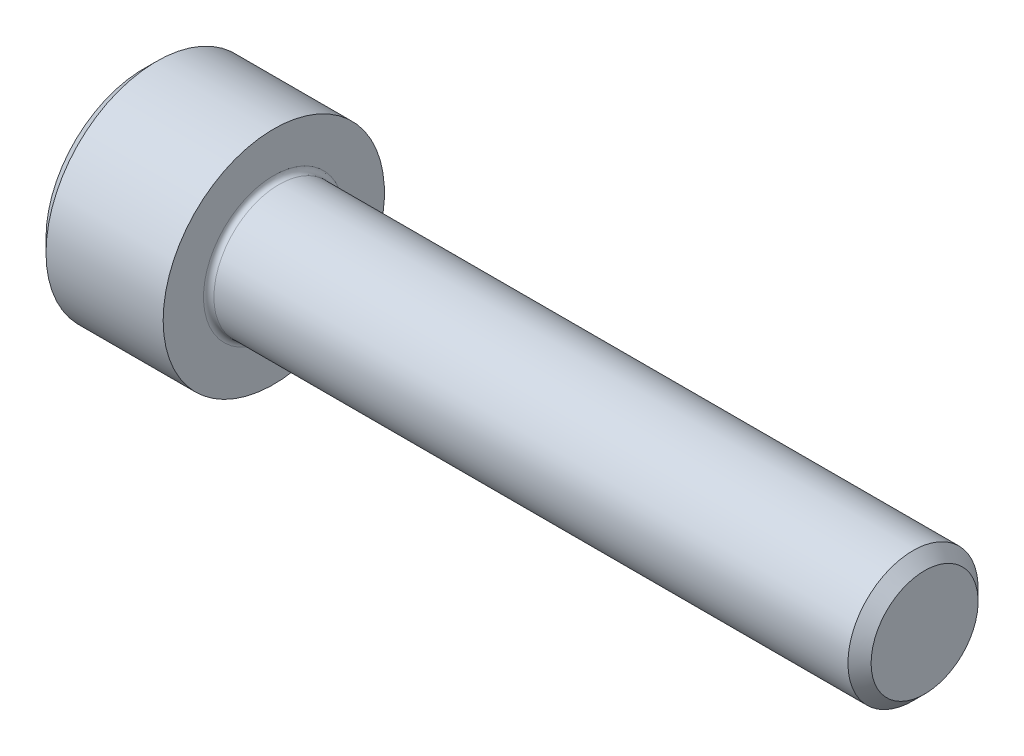
ISO-10303-21;
HEADER;
FILE_DESCRIPTION(('STEP AP214'),'2;1');
FILE_NAME('part.step','',(''),(''),'','','');
FILE_SCHEMA(('AUTOMOTIVE_DESIGN { 1 0 10303 214 1 1 1 1 }'));
ENDSEC;
DATA;
#1=APPLICATION_CONTEXT('core data for automotive mechanical design processes');
#2=APPLICATION_PROTOCOL_DEFINITION('international standard','automotive_design',2000,#1);
#3=PRODUCT_CONTEXT('',#1,'mechanical');
#4=PRODUCT('Part','Part','',(#3));
#5=PRODUCT_RELATED_PRODUCT_CATEGORY('part','',(#4));
#6=PRODUCT_DEFINITION_FORMATION('','',#4);
#7=PRODUCT_DEFINITION_CONTEXT('part definition',#1,'design');
#8=PRODUCT_DEFINITION('design','',#6,#7);
#9=PRODUCT_DEFINITION_SHAPE('','',#8);
#10=(LENGTH_UNIT() NAMED_UNIT(*) SI_UNIT(.MILLI.,.METRE.));
#11=(NAMED_UNIT(*) PLANE_ANGLE_UNIT() SI_UNIT($,.RADIAN.));
#12=(NAMED_UNIT(*) SI_UNIT($,.STERADIAN.) SOLID_ANGLE_UNIT());
#13=UNCERTAINTY_MEASURE_WITH_UNIT(LENGTH_MEASURE(1.E-05),#10,'distance_accuracy_value','');
#14=(GEOMETRIC_REPRESENTATION_CONTEXT(3) GLOBAL_UNCERTAINTY_ASSIGNED_CONTEXT((#13)) GLOBAL_UNIT_ASSIGNED_CONTEXT((#10,
#11,#12)) REPRESENTATION_CONTEXT('',''));
#15=CARTESIAN_POINT('',(0.,0.,0.));
#16=DIRECTION('',(0.,0.,1.));
#17=DIRECTION('',(1.,0.,0.));
#18=AXIS2_PLACEMENT_3D('',#15,#16,#17);
#19=CARTESIAN_POINT('',(0.,0.,0.));
#20=DIRECTION('',(-1.,0.,0.));
#21=DIRECTION('',(0.,0.,1.));
#22=AXIS2_PLACEMENT_3D('',#19,#20,#21);
#23=PLANE('',#22);
#24=DIRECTION('',(0.,-0.499999999999999,0.866025403784439));
#25=VECTOR('',#24,1.);
#26=CARTESIAN_POINT('',(0.,2.35789849937043,0.));
#27=LINE('',#26,#25);
#28=CARTESIAN_POINT('',(0.,2.35789849937043,0.));
#29=VERTEX_POINT('',#28);
#30=CARTESIAN_POINT('',(0.,1.17894924968522,2.042));
#31=VERTEX_POINT('',#30);
#32=EDGE_CURVE('E114',#29,#31,#27,.T.);
#33=ORIENTED_EDGE('',*,*,#32,.T.);
#34=DIRECTION('',(0.,1.,0.));
#35=VECTOR('',#34,1.);
#36=CARTESIAN_POINT('',(0.,-1.17894924968522,2.042));
#37=LINE('',#36,#35);
#38=CARTESIAN_POINT('',(0.,-1.17894924968522,2.042));
#39=VERTEX_POINT('',#38);
#40=EDGE_CURVE('E103',#39,#31,#37,.T.);
#41=ORIENTED_EDGE('',*,*,#40,.F.);
#42=DIRECTION('',(0.,-0.500000000000001,-0.866025403784438));
#43=VECTOR('',#42,1.);
#44=CARTESIAN_POINT('',(0.,-1.17894924968522,2.042));
#45=LINE('',#44,#43);
#46=CARTESIAN_POINT('',(0.,-2.35789849937043,0.));
#47=VERTEX_POINT('',#46);
#48=EDGE_CURVE('E113',#39,#47,#45,.T.);
#49=ORIENTED_EDGE('',*,*,#48,.T.);
#50=DIRECTION('',(0.,0.499999999999998,-0.86602540378444));
#51=VECTOR('',#50,1.);
#52=CARTESIAN_POINT('',(0.,-2.35789849937043,0.));
#53=LINE('',#52,#51);
#54=CARTESIAN_POINT('',(0.,-1.17894924968522,-2.042));
#55=VERTEX_POINT('',#54);
#56=EDGE_CURVE('E132',#47,#55,#53,.T.);
#57=ORIENTED_EDGE('',*,*,#56,.T.);
#58=DIRECTION('',(0.,-1.,0.));
#59=VECTOR('',#58,1.);
#60=CARTESIAN_POINT('',(0.,1.17894924968521,-2.042));
#61=LINE('',#60,#59);
#62=CARTESIAN_POINT('',(0.,1.17894924968521,-2.042));
#63=VERTEX_POINT('',#62);
#64=EDGE_CURVE('E135',#63,#55,#61,.T.);
#65=ORIENTED_EDGE('',*,*,#64,.F.);
#66=DIRECTION('',(0.,-0.500000000000001,-0.866025403784438));
#67=VECTOR('',#66,1.);
#68=CARTESIAN_POINT('',(0.,2.35789849937043,0.));
#69=LINE('',#68,#67);
#70=EDGE_CURVE('E128',#29,#63,#69,.T.);
#71=ORIENTED_EDGE('',*,*,#70,.F.);
#72=EDGE_LOOP('',(#33,#41,#49,#57,#65,#71));
#73=FACE_BOUND('',#72,.T.);
#74=CARTESIAN_POINT('',(0.,0.,0.));
#75=DIRECTION('',(-1.,0.,0.));
#76=DIRECTION('',(0.,0.,1.));
#77=AXIS2_PLACEMENT_3D('',#74,#75,#76);
#78=CIRCLE('',#77,3.75);
#79=CARTESIAN_POINT('',(0.,0.,3.75));
#80=VERTEX_POINT('',#79);
#81=EDGE_CURVE('E186',#80,#80,#78,.T.);
#82=ORIENTED_EDGE('',*,*,#81,.T.);
#83=EDGE_LOOP('',(#82));
#84=FACE_BOUND('',#83,.T.);
#85=ADVANCED_FACE('F32',(#73,#84),#23,.T.);
#86=CARTESIAN_POINT('',(0.,0.,0.));
#87=DIRECTION('',(1.,0.,0.));
#88=DIRECTION('',(0.,0.,-1.));
#89=AXIS2_PLACEMENT_3D('',#86,#87,#88);
#90=CONICAL_SURFACE('',#89,3.75,0.785398163397443);
#91=CARTESIAN_POINT('',(0.5,0.,0.));
#92=DIRECTION('',(-1.,0.,0.));
#93=DIRECTION('',(0.,0.,1.));
#94=AXIS2_PLACEMENT_3D('',#91,#92,#93);
#95=CIRCLE('',#94,4.25);
#96=CARTESIAN_POINT('',(0.5,0.,4.25));
#97=VERTEX_POINT('',#96);
#98=EDGE_CURVE('E183',#97,#97,#95,.T.);
#99=ORIENTED_EDGE('',*,*,#98,.T.);
#100=EDGE_LOOP('',(#99));
#101=FACE_BOUND('',#100,.T.);
#102=ORIENTED_EDGE('',*,*,#81,.F.);
#103=EDGE_LOOP('',(#102));
#104=FACE_BOUND('',#103,.T.);
#105=ADVANCED_FACE('F210',(#101,#104),#90,.T.);
#106=CARTESIAN_POINT('',(-31.75,0.,0.));
#107=DIRECTION('',(-1.,0.,0.));
#108=DIRECTION('',(0.,0.,1.));
#109=AXIS2_PLACEMENT_3D('',#106,#107,#108);
#110=CYLINDRICAL_SURFACE('',#109,4.25);
#111=CARTESIAN_POINT('',(5.,0.,0.));
#112=DIRECTION('',(-1.,0.,0.));
#113=DIRECTION('',(0.,0.,1.));
#114=AXIS2_PLACEMENT_3D('',#111,#112,#113);
#115=CIRCLE('',#114,4.25);
#116=CARTESIAN_POINT('',(5.,0.,4.25));
#117=VERTEX_POINT('',#116);
#118=EDGE_CURVE('E180',#117,#117,#115,.T.);
#119=ORIENTED_EDGE('',*,*,#118,.T.);
#120=EDGE_LOOP('',(#119));
#121=FACE_BOUND('',#120,.T.);
#122=ORIENTED_EDGE('',*,*,#98,.F.);
#123=EDGE_LOOP('',(#122));
#124=FACE_BOUND('',#123,.T.);
#125=ADVANCED_FACE('F214',(#121,#124),#110,.T.);
#126=CARTESIAN_POINT('',(5.,4.25,0.));
#127=DIRECTION('',(1.,0.,0.));
#128=DIRECTION('',(0.,0.,-1.));
#129=AXIS2_PLACEMENT_3D('',#126,#127,#128);
#130=PLANE('',#129);
#131=CARTESIAN_POINT('',(5.,0.,0.));
#132=DIRECTION('',(1.,0.,0.));
#133=DIRECTION('',(0.,0.,-1.));
#134=AXIS2_PLACEMENT_3D('',#131,#132,#133);
#135=CIRCLE('',#134,2.7);
#136=CARTESIAN_POINT('',(5.,0.,-2.7));
#137=VERTEX_POINT('',#136);
#138=EDGE_CURVE('E39',#137,#137,#135,.F.);
#139=ORIENTED_EDGE('',*,*,#138,.T.);
#140=EDGE_LOOP('',(#139));
#141=FACE_BOUND('',#140,.T.);
#142=ORIENTED_EDGE('',*,*,#118,.F.);
#143=EDGE_LOOP('',(#142));
#144=FACE_BOUND('',#143,.T.);
#145=ADVANCED_FACE('F191',(#141,#144),#130,.T.);
#146=CARTESIAN_POINT('',(-31.75,0.,0.));
#147=DIRECTION('',(-1.,0.,0.));
#148=DIRECTION('',(0.,0.,1.));
#149=AXIS2_PLACEMENT_3D('',#146,#147,#148);
#150=CYLINDRICAL_SURFACE('',#149,2.5);
#151=CARTESIAN_POINT('',(5.2,0.,0.));
#152=DIRECTION('',(1.,0.,0.));
#153=DIRECTION('',(0.,0.,-1.));
#154=AXIS2_PLACEMENT_3D('',#151,#152,#153);
#155=CIRCLE('',#154,2.5);
#156=CARTESIAN_POINT('',(5.2,0.,-2.5));
#157=VERTEX_POINT('',#156);
#158=EDGE_CURVE('E11',#157,#157,#155,.T.);
#159=ORIENTED_EDGE('',*,*,#158,.T.);
#160=EDGE_LOOP('',(#159));
#161=FACE_BOUND('',#160,.T.);
#162=CARTESIAN_POINT('',(29.555,0.,0.));
#163=DIRECTION('',(-1.,0.,0.));
#164=DIRECTION('',(0.,0.,1.));
#165=AXIS2_PLACEMENT_3D('',#162,#163,#164);
#166=CIRCLE('',#165,2.5);
#167=CARTESIAN_POINT('',(29.555,0.,2.5));
#168=VERTEX_POINT('',#167);
#169=EDGE_CURVE('E177',#168,#168,#166,.T.);
#170=ORIENTED_EDGE('',*,*,#169,.T.);
#171=EDGE_LOOP('',(#170));
#172=FACE_BOUND('',#171,.T.);
#173=ADVANCED_FACE('F225',(#161,#172),#150,.T.);
#174=CARTESIAN_POINT('',(30.,0.,0.));
#175=DIRECTION('',(-1.,0.,0.));
#176=DIRECTION('',(0.,0.,1.));
#177=AXIS2_PLACEMENT_3D('',#174,#175,#176);
#178=CONICAL_SURFACE('',#177,2.055,0.785398163397462);
#179=ORIENTED_EDGE('',*,*,#169,.F.);
#180=EDGE_LOOP('',(#179));
#181=FACE_BOUND('',#180,.T.);
#182=CARTESIAN_POINT('',(30.,0.,0.));
#183=DIRECTION('',(-1.,0.,0.));
#184=DIRECTION('',(0.,0.,1.));
#185=AXIS2_PLACEMENT_3D('',#182,#183,#184);
#186=CIRCLE('',#185,2.055);
#187=CARTESIAN_POINT('',(30.,0.,2.055));
#188=VERTEX_POINT('',#187);
#189=EDGE_CURVE('E173',#188,#188,#186,.T.);
#190=ORIENTED_EDGE('',*,*,#189,.T.);
#191=EDGE_LOOP('',(#190));
#192=FACE_BOUND('',#191,.T.);
#193=ADVANCED_FACE('F204',(#181,#192),#178,.T.);
#194=CARTESIAN_POINT('',(30.,2.055,0.));
#195=DIRECTION('',(1.,0.,0.));
#196=DIRECTION('',(0.,0.,-1.));
#197=AXIS2_PLACEMENT_3D('',#194,#195,#196);
#198=PLANE('',#197);
#199=ORIENTED_EDGE('',*,*,#189,.F.);
#200=EDGE_LOOP('',(#199));
#201=FACE_BOUND('',#200,.T.);
#202=ADVANCED_FACE('F196',(#201),#198,.T.);
#203=CARTESIAN_POINT('',(5.2,0.,0.));
#204=DIRECTION('',(1.,0.,0.));
#205=DIRECTION('',(0.,0.,-1.));
#206=AXIS2_PLACEMENT_3D('',#203,#204,#205);
#207=TOROIDAL_SURFACE('',#206,2.7,0.2);
#208=ORIENTED_EDGE('',*,*,#158,.F.);
#209=EDGE_LOOP('',(#208));
#210=FACE_BOUND('',#209,.T.);
#211=ORIENTED_EDGE('',*,*,#138,.F.);
#212=EDGE_LOOP('',(#211));
#213=FACE_BOUND('',#212,.T.);
#214=ADVANCED_FACE('F194',(#210,#213),#207,.F.);
#215=CARTESIAN_POINT('',(2.5,2.35789849937043,0.));
#216=DIRECTION('',(0.,-0.866025403784439,-0.499999999999999));
#217=DIRECTION('',(0.,0.499999999999999,-0.866025403784439));
#218=AXIS2_PLACEMENT_3D('',#215,#216,#217);
#219=PLANE('',#218);
#220=ORIENTED_EDGE('',*,*,#32,.F.);
#221=DIRECTION('',(-1.,0.,0.));
#222=VECTOR('',#221,1.);
#223=CARTESIAN_POINT('',(2.5,2.35789849937043,0.));
#224=LINE('',#223,#222);
#225=CARTESIAN_POINT('',(2.5,2.35789849937043,0.));
#226=VERTEX_POINT('',#225);
#227=EDGE_CURVE('E158',#226,#29,#224,.T.);
#228=ORIENTED_EDGE('',*,*,#227,.F.);
#229=DIRECTION('',(0.,-0.499999999999999,0.866025403784439));
#230=VECTOR('',#229,1.);
#231=CARTESIAN_POINT('',(2.5,2.35789849937043,0.));
#232=LINE('',#231,#230);
#233=CARTESIAN_POINT('',(2.5,1.76842387452782,1.021));
#234=VERTEX_POINT('',#233);
#235=EDGE_CURVE('E138',#226,#234,#232,.T.);
#236=ORIENTED_EDGE('',*,*,#235,.T.);
#237=CARTESIAN_POINT('',(2.5,1.17894924968522,2.042));
#238=VERTEX_POINT('',#237);
#239=EDGE_CURVE('E122',#234,#238,#232,.T.);
#240=ORIENTED_EDGE('',*,*,#239,.T.);
#241=DIRECTION('',(-1.,0.,0.));
#242=VECTOR('',#241,1.);
#243=CARTESIAN_POINT('',(2.5,1.17894924968522,2.042));
#244=LINE('',#243,#242);
#245=EDGE_CURVE('E107',#238,#31,#244,.T.);
#246=ORIENTED_EDGE('',*,*,#245,.T.);
#247=EDGE_LOOP('',(#220,#228,#236,#240,#246));
#248=FACE_BOUND('',#247,.T.);
#249=ADVANCED_FACE('F118',(#248),#219,.T.);
#250=CARTESIAN_POINT('',(2.5,-1.17894924968522,2.042));
#251=DIRECTION('',(0.,0.,1.));
#252=DIRECTION('',(0.,-1.,0.));
#253=AXIS2_PLACEMENT_3D('',#250,#251,#252);
#254=PLANE('',#253);
#255=ORIENTED_EDGE('',*,*,#40,.T.);
#256=ORIENTED_EDGE('',*,*,#245,.F.);
#257=DIRECTION('',(0.,1.,0.));
#258=VECTOR('',#257,1.);
#259=CARTESIAN_POINT('',(2.5,-1.17894924968522,2.042));
#260=LINE('',#259,#258);
#261=CARTESIAN_POINT('',(2.5,0.,2.042));
#262=VERTEX_POINT('',#261);
#263=EDGE_CURVE('E140',#262,#238,#260,.T.);
#264=ORIENTED_EDGE('',*,*,#263,.F.);
#265=CARTESIAN_POINT('',(2.5,-1.17894924968522,2.042));
#266=VERTEX_POINT('',#265);
#267=EDGE_CURVE('E141',#266,#262,#260,.T.);
#268=ORIENTED_EDGE('',*,*,#267,.F.);
#269=DIRECTION('',(-1.,0.,0.));
#270=VECTOR('',#269,1.);
#271=CARTESIAN_POINT('',(2.5,-1.17894924968522,2.042));
#272=LINE('',#271,#270);
#273=EDGE_CURVE('E109',#266,#39,#272,.T.);
#274=ORIENTED_EDGE('',*,*,#273,.T.);
#275=EDGE_LOOP('',(#255,#256,#264,#268,#274));
#276=FACE_BOUND('',#275,.T.);
#277=ADVANCED_FACE('F105',(#276),#254,.F.);
#278=CARTESIAN_POINT('',(2.5,-1.17894924968522,2.042));
#279=DIRECTION('',(0.,0.866025403784438,-0.500000000000001));
#280=DIRECTION('',(0.,0.500000000000001,0.866025403784438));
#281=AXIS2_PLACEMENT_3D('',#278,#279,#280);
#282=PLANE('',#281);
#283=ORIENTED_EDGE('',*,*,#48,.F.);
#284=ORIENTED_EDGE('',*,*,#273,.F.);
#285=DIRECTION('',(0.,-0.500000000000001,-0.866025403784438));
#286=VECTOR('',#285,1.);
#287=CARTESIAN_POINT('',(2.5,-1.17894924968522,2.042));
#288=LINE('',#287,#286);
#289=CARTESIAN_POINT('',(2.5,-1.76842387452782,1.021));
#290=VERTEX_POINT('',#289);
#291=EDGE_CURVE('E145',#266,#290,#288,.T.);
#292=ORIENTED_EDGE('',*,*,#291,.T.);
#293=CARTESIAN_POINT('',(2.5,-2.35789849937043,0.));
#294=VERTEX_POINT('',#293);
#295=EDGE_CURVE('E144',#290,#294,#288,.T.);
#296=ORIENTED_EDGE('',*,*,#295,.T.);
#297=DIRECTION('',(-1.,0.,0.));
#298=VECTOR('',#297,1.);
#299=CARTESIAN_POINT('',(2.5,-2.35789849937043,0.));
#300=LINE('',#299,#298);
#301=EDGE_CURVE('E166',#294,#47,#300,.T.);
#302=ORIENTED_EDGE('',*,*,#301,.T.);
#303=EDGE_LOOP('',(#283,#284,#292,#296,#302));
#304=FACE_BOUND('',#303,.T.);
#305=ADVANCED_FACE('F279',(#304),#282,.T.);
#306=CARTESIAN_POINT('',(2.5,-2.35789849937043,0.));
#307=DIRECTION('',(0.,0.86602540378444,0.499999999999998));
#308=DIRECTION('',(0.,-0.499999999999998,0.86602540378444));
#309=AXIS2_PLACEMENT_3D('',#306,#307,#308);
#310=PLANE('',#309);
#311=ORIENTED_EDGE('',*,*,#56,.F.);
#312=ORIENTED_EDGE('',*,*,#301,.F.);
#313=DIRECTION('',(0.,0.499999999999998,-0.86602540378444));
#314=VECTOR('',#313,1.);
#315=CARTESIAN_POINT('',(2.5,-2.35789849937043,0.));
#316=LINE('',#315,#314);
#317=CARTESIAN_POINT('',(2.5,-1.76842387452783,-1.021));
#318=VERTEX_POINT('',#317);
#319=EDGE_CURVE('E149',#294,#318,#316,.T.);
#320=ORIENTED_EDGE('',*,*,#319,.T.);
#321=CARTESIAN_POINT('',(2.5,-1.17894924968522,-2.042));
#322=VERTEX_POINT('',#321);
#323=EDGE_CURVE('E148',#318,#322,#316,.T.);
#324=ORIENTED_EDGE('',*,*,#323,.T.);
#325=DIRECTION('',(-1.,0.,0.));
#326=VECTOR('',#325,1.);
#327=CARTESIAN_POINT('',(2.5,-1.17894924968522,-2.042));
#328=LINE('',#327,#326);
#329=EDGE_CURVE('E163',#322,#55,#328,.T.);
#330=ORIENTED_EDGE('',*,*,#329,.T.);
#331=EDGE_LOOP('',(#311,#312,#320,#324,#330));
#332=FACE_BOUND('',#331,.T.);
#333=ADVANCED_FACE('F288',(#332),#310,.T.);
#334=CARTESIAN_POINT('',(2.5,1.17894924968521,-2.042));
#335=DIRECTION('',(0.,0.,-1.));
#336=DIRECTION('',(0.,1.,0.));
#337=AXIS2_PLACEMENT_3D('',#334,#335,#336);
#338=PLANE('',#337);
#339=ORIENTED_EDGE('',*,*,#64,.T.);
#340=ORIENTED_EDGE('',*,*,#329,.F.);
#341=DIRECTION('',(0.,-1.,0.));
#342=VECTOR('',#341,1.);
#343=CARTESIAN_POINT('',(2.5,1.17894924968521,-2.042));
#344=LINE('',#343,#342);
#345=CARTESIAN_POINT('',(2.5,0.,-2.042));
#346=VERTEX_POINT('',#345);
#347=EDGE_CURVE('E152',#346,#322,#344,.T.);
#348=ORIENTED_EDGE('',*,*,#347,.F.);
#349=CARTESIAN_POINT('',(2.5,1.17894924968521,-2.042));
#350=VERTEX_POINT('',#349);
#351=EDGE_CURVE('E46',#350,#346,#344,.T.);
#352=ORIENTED_EDGE('',*,*,#351,.F.);
#353=DIRECTION('',(-1.,0.,0.));
#354=VECTOR('',#353,1.);
#355=CARTESIAN_POINT('',(2.5,1.17894924968521,-2.042));
#356=LINE('',#355,#354);
#357=EDGE_CURVE('E160',#350,#63,#356,.T.);
#358=ORIENTED_EDGE('',*,*,#357,.T.);
#359=EDGE_LOOP('',(#339,#340,#348,#352,#358));
#360=FACE_BOUND('',#359,.T.);
#361=ADVANCED_FACE('F298',(#360),#338,.F.);
#362=CARTESIAN_POINT('',(2.5,2.35789849937043,0.));
#363=DIRECTION('',(0.,0.866025403784438,-0.500000000000001));
#364=DIRECTION('',(0.,0.500000000000001,0.866025403784438));
#365=AXIS2_PLACEMENT_3D('',#362,#363,#364);
#366=PLANE('',#365);
#367=ORIENTED_EDGE('',*,*,#70,.T.);
#368=ORIENTED_EDGE('',*,*,#357,.F.);
#369=DIRECTION('',(0.,-0.500000000000001,-0.866025403784438));
#370=VECTOR('',#369,1.);
#371=CARTESIAN_POINT('',(2.5,2.35789849937043,0.));
#372=LINE('',#371,#370);
#373=CARTESIAN_POINT('',(2.5,1.76842387452782,-1.021));
#374=VERTEX_POINT('',#373);
#375=EDGE_CURVE('E154',#374,#350,#372,.T.);
#376=ORIENTED_EDGE('',*,*,#375,.F.);
#377=EDGE_CURVE('E155',#226,#374,#372,.T.);
#378=ORIENTED_EDGE('',*,*,#377,.F.);
#379=ORIENTED_EDGE('',*,*,#227,.T.);
#380=EDGE_LOOP('',(#367,#368,#376,#378,#379));
#381=FACE_BOUND('',#380,.T.);
#382=ADVANCED_FACE('F308',(#381),#366,.F.);
#383=CARTESIAN_POINT('',(2.5,3.53684774905564,-2.04200000000001));
#384=DIRECTION('',(1.,0.,0.));
#385=DIRECTION('',(0.,0.,-1.));
#386=AXIS2_PLACEMENT_3D('',#383,#384,#385);
#387=PLANE('',#386);
#388=ORIENTED_EDGE('',*,*,#347,.T.);
#389=ORIENTED_EDGE('',*,*,#323,.F.);
#390=CARTESIAN_POINT('',(2.5,0.,0.));
#391=DIRECTION('',(-1.,0.,0.));
#392=DIRECTION('',(0.,0.,1.));
#393=AXIS2_PLACEMENT_3D('',#390,#391,#392);
#394=CIRCLE('',#393,2.042);
#395=EDGE_CURVE('E394',#346,#318,#394,.T.);
#396=ORIENTED_EDGE('',*,*,#395,.F.);
#397=EDGE_LOOP('',(#388,#389,#396));
#398=FACE_BOUND('',#397,.T.);
#399=ADVANCED_FACE('F318',(#398),#387,.F.);
#400=ORIENTED_EDGE('',*,*,#319,.F.);
#401=ORIENTED_EDGE('',*,*,#295,.F.);
#402=EDGE_CURVE('E392',#318,#290,#394,.T.);
#403=ORIENTED_EDGE('',*,*,#402,.F.);
#404=EDGE_LOOP('',(#400,#401,#403));
#405=FACE_BOUND('',#404,.T.);
#406=ADVANCED_FACE('F328',(#405),#387,.F.);
#407=ORIENTED_EDGE('',*,*,#291,.F.);
#408=ORIENTED_EDGE('',*,*,#267,.T.);
#409=EDGE_CURVE('E123',#290,#262,#394,.T.);
#410=ORIENTED_EDGE('',*,*,#409,.F.);
#411=EDGE_LOOP('',(#407,#408,#410));
#412=FACE_BOUND('',#411,.T.);
#413=ADVANCED_FACE('F339',(#412),#387,.F.);
#414=ORIENTED_EDGE('',*,*,#263,.T.);
#415=ORIENTED_EDGE('',*,*,#239,.F.);
#416=EDGE_CURVE('E170',#262,#234,#394,.T.);
#417=ORIENTED_EDGE('',*,*,#416,.F.);
#418=EDGE_LOOP('',(#414,#415,#417));
#419=FACE_BOUND('',#418,.T.);
#420=ADVANCED_FACE('F348',(#419),#387,.F.);
#421=ORIENTED_EDGE('',*,*,#235,.F.);
#422=ORIENTED_EDGE('',*,*,#377,.T.);
#423=EDGE_CURVE('E174',#234,#374,#394,.T.);
#424=ORIENTED_EDGE('',*,*,#423,.F.);
#425=EDGE_LOOP('',(#421,#422,#424));
#426=FACE_BOUND('',#425,.T.);
#427=ADVANCED_FACE('F357',(#426),#387,.F.);
#428=ORIENTED_EDGE('',*,*,#375,.T.);
#429=ORIENTED_EDGE('',*,*,#351,.T.);
#430=EDGE_CURVE('E397',#374,#346,#394,.T.);
#431=ORIENTED_EDGE('',*,*,#430,.F.);
#432=EDGE_LOOP('',(#428,#429,#431));
#433=FACE_BOUND('',#432,.T.);
#434=ADVANCED_FACE('F331',(#433),#387,.F.);
#435=CARTESIAN_POINT('',(2.5,0.,0.));
#436=DIRECTION('',(-1.,0.,0.));
#437=DIRECTION('',(0.,0.,1.));
#438=AXIS2_PLACEMENT_3D('',#435,#436,#437);
#439=CONICAL_SURFACE('',#438,2.042,1.04719755119659);
#440=CARTESIAN_POINT('',(3.67894924968524,0.,0.));
#441=VERTEX_POINT('',#440);
#442=VERTEX_LOOP('',#441);
#443=FACE_BOUND('',#442,.T.);
#444=ORIENTED_EDGE('',*,*,#416,.T.);
#445=ORIENTED_EDGE('',*,*,#423,.T.);
#446=ORIENTED_EDGE('',*,*,#430,.T.);
#447=ORIENTED_EDGE('',*,*,#395,.T.);
#448=ORIENTED_EDGE('',*,*,#402,.T.);
#449=ORIENTED_EDGE('',*,*,#409,.T.);
#450=EDGE_LOOP('',(#444,#445,#446,#447,#448,#449));
#451=FACE_BOUND('',#450,.T.);
#452=ADVANCED_FACE('F374',(#443,#451),#439,.F.);
#453=CLOSED_SHELL('',(#85,#105,#125,#145,#173,#193,#202,#214,#249,#277,#305,#333,#361,#382,#399,
#406,#413,#420,#427,#434,#452));
#454=MANIFOLD_SOLID_BREP('B2',#453);
#455=ADVANCED_BREP_SHAPE_REPRESENTATION('',(#18,#454),#14);
#456=SHAPE_DEFINITION_REPRESENTATION(#9,#455);
ENDSEC;
END-ISO-10303-21;
